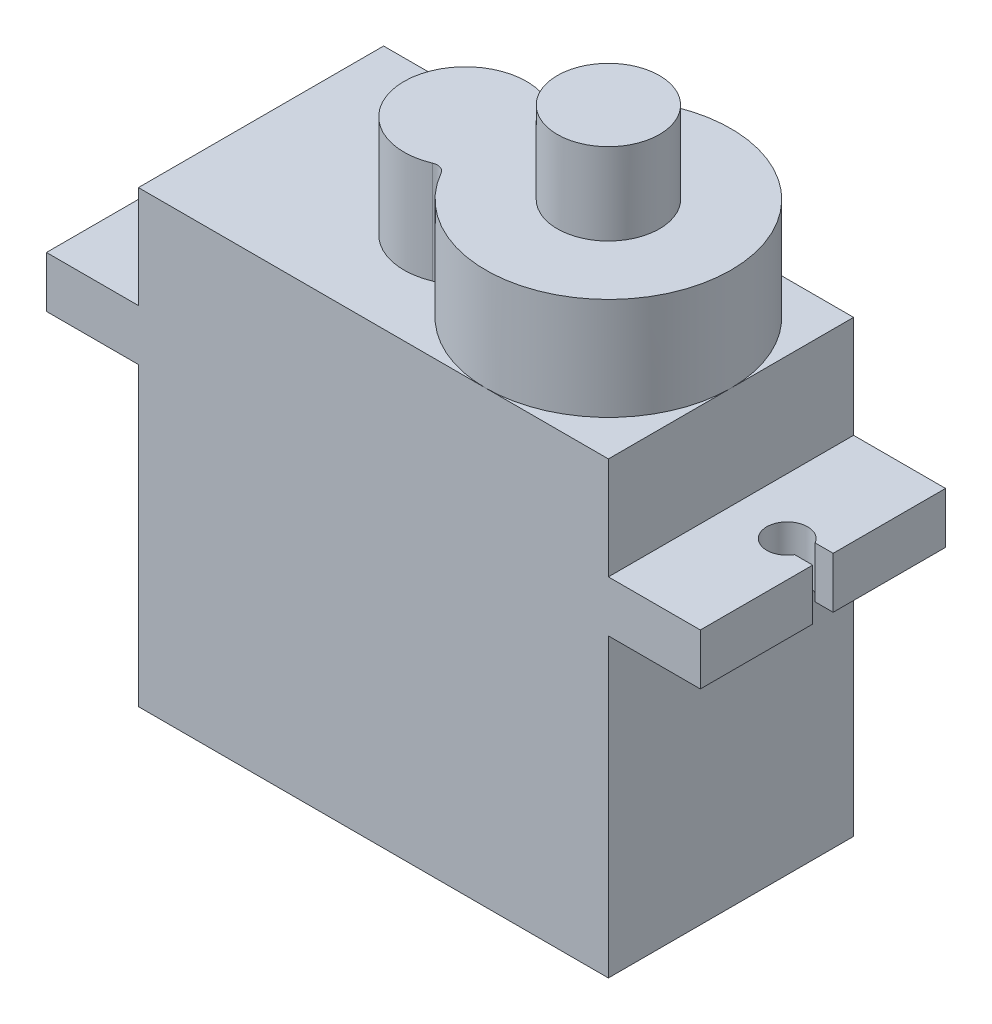
ISO-10303-21;
HEADER;
FILE_DESCRIPTION(('STEP AP214'),'2;1');
FILE_NAME('part.step','',(''),(''),'','','');
FILE_SCHEMA(('AUTOMOTIVE_DESIGN { 1 0 10303 214 1 1 1 1 }'));
ENDSEC;
DATA;
#1=APPLICATION_CONTEXT('core data for automotive mechanical design processes');
#2=APPLICATION_PROTOCOL_DEFINITION('international standard','automotive_design',2000,#1);
#3=PRODUCT_CONTEXT('',#1,'mechanical');
#4=PRODUCT('Part','Part','',(#3));
#5=PRODUCT_RELATED_PRODUCT_CATEGORY('part','',(#4));
#6=PRODUCT_DEFINITION_FORMATION('','',#4);
#7=PRODUCT_DEFINITION_CONTEXT('part definition',#1,'design');
#8=PRODUCT_DEFINITION('design','',#6,#7);
#9=PRODUCT_DEFINITION_SHAPE('','',#8);
#10=(LENGTH_UNIT() NAMED_UNIT(*) SI_UNIT(.MILLI.,.METRE.));
#11=(NAMED_UNIT(*) PLANE_ANGLE_UNIT() SI_UNIT($,.RADIAN.));
#12=(NAMED_UNIT(*) SI_UNIT($,.STERADIAN.) SOLID_ANGLE_UNIT());
#13=UNCERTAINTY_MEASURE_WITH_UNIT(LENGTH_MEASURE(1.E-05),#10,'distance_accuracy_value','');
#14=(GEOMETRIC_REPRESENTATION_CONTEXT(3) GLOBAL_UNCERTAINTY_ASSIGNED_CONTEXT((#13)) GLOBAL_UNIT_ASSIGNED_CONTEXT((#10,
#11,#12)) REPRESENTATION_CONTEXT('',''));
#15=CARTESIAN_POINT('',(0.,0.,0.));
#16=DIRECTION('',(0.,0.,1.));
#17=DIRECTION('',(1.,0.,0.));
#18=AXIS2_PLACEMENT_3D('',#15,#16,#17);
#19=CARTESIAN_POINT('',(0.,22.,0.));
#20=DIRECTION('',(0.,-1.,0.));
#21=DIRECTION('',(0.,0.,-1.));
#22=AXIS2_PLACEMENT_3D('',#19,#20,#21);
#23=PLANE('',#22);
#24=CARTESIAN_POINT('',(-0.142857142857141,22.,3.22616851161035));
#25=DIRECTION('',(0.,-1.,0.));
#26=DIRECTION('',(0.,0.,-1.));
#27=AXIS2_PLACEMENT_3D('',#24,#25,#26);
#28=CIRCLE('',#27,0.5);
#29=CARTESIAN_POINT('',(-0.33673469387755,22.,2.76528729566601));
#30=VERTEX_POINT('',#29);
#31=CARTESIAN_POINT('',(0.291208791208792,22.,2.97800170302494));
#32=VERTEX_POINT('',#31);
#33=EDGE_CURVE('E51',#30,#32,#28,.T.);
#34=ORIENTED_EDGE('',*,*,#33,.F.);
#35=CARTESIAN_POINT('',(-1.5,22.,0.));
#36=DIRECTION('',(0.,1.,0.));
#37=DIRECTION('',(0.,0.,1.));
#38=AXIS2_PLACEMENT_3D('',#35,#36,#37);
#39=CIRCLE('',#38,3.);
#40=CARTESIAN_POINT('',(-0.336734693877549,22.,-2.76528729566601));
#41=VERTEX_POINT('',#40);
#42=EDGE_CURVE('E55',#41,#30,#39,.T.);
#43=ORIENTED_EDGE('',*,*,#42,.F.);
#44=CARTESIAN_POINT('',(-0.142857142857141,22.,-3.22616851161035));
#45=DIRECTION('',(0.,-1.,0.));
#46=DIRECTION('',(0.,0.,1.));
#47=AXIS2_PLACEMENT_3D('',#44,#45,#46);
#48=CIRCLE('',#47,0.5);
#49=CARTESIAN_POINT('',(0.291208791208794,22.,-2.97800170302494));
#50=VERTEX_POINT('',#49);
#51=EDGE_CURVE('E385',#50,#41,#48,.T.);
#52=ORIENTED_EDGE('',*,*,#51,.F.);
#53=CARTESIAN_POINT('',(5.5,22.,0.));
#54=DIRECTION('',(0.,1.,0.));
#55=DIRECTION('',(0.,0.,1.));
#56=AXIS2_PLACEMENT_3D('',#53,#54,#55);
#57=CIRCLE('',#56,6.);
#58=CARTESIAN_POINT('',(5.5,22.,-6.));
#59=VERTEX_POINT('',#58);
#60=EDGE_CURVE('E376',#59,#50,#57,.T.);
#61=ORIENTED_EDGE('',*,*,#60,.F.);
#62=DIRECTION('',(-1.,0.,0.));
#63=VECTOR('',#62,1.);
#64=CARTESIAN_POINT('',(-11.5,22.,-6.));
#65=LINE('',#64,#63);
#66=CARTESIAN_POINT('',(-11.5,22.,-6.));
#67=VERTEX_POINT('',#66);
#68=EDGE_CURVE('E329',#59,#67,#65,.T.);
#69=ORIENTED_EDGE('',*,*,#68,.T.);
#70=DIRECTION('',(0.,0.,1.));
#71=VECTOR('',#70,1.);
#72=CARTESIAN_POINT('',(-11.5,22.,6.));
#73=LINE('',#72,#71);
#74=CARTESIAN_POINT('',(-11.5,22.,6.));
#75=VERTEX_POINT('',#74);
#76=EDGE_CURVE('E334',#67,#75,#73,.T.);
#77=ORIENTED_EDGE('',*,*,#76,.T.);
#78=DIRECTION('',(1.,0.,0.));
#79=VECTOR('',#78,1.);
#80=CARTESIAN_POINT('',(-11.5,22.,6.));
#81=LINE('',#80,#79);
#82=CARTESIAN_POINT('',(5.5,22.,6.));
#83=VERTEX_POINT('',#82);
#84=EDGE_CURVE('E337',#75,#83,#81,.T.);
#85=ORIENTED_EDGE('',*,*,#84,.T.);
#86=EDGE_CURVE('E381',#32,#83,#57,.T.);
#87=ORIENTED_EDGE('',*,*,#86,.F.);
#88=EDGE_LOOP('',(#34,#43,#52,#61,#69,#77,#85,#87));
#89=FACE_BOUND('',#88,.T.);
#90=ADVANCED_FACE('F36',(#89),#23,.F.);
#91=CARTESIAN_POINT('',(11.5,22.,0.));
#92=VERTEX_POINT('',#91);
#93=EDGE_CURVE('E44',#83,#92,#57,.T.);
#94=ORIENTED_EDGE('',*,*,#93,.F.);
#95=CARTESIAN_POINT('',(11.5,22.,6.));
#96=VERTEX_POINT('',#95);
#97=EDGE_CURVE('E336',#83,#96,#81,.T.);
#98=ORIENTED_EDGE('',*,*,#97,.T.);
#99=DIRECTION('',(0.,0.,-1.));
#100=VECTOR('',#99,1.);
#101=CARTESIAN_POINT('',(11.5,22.,6.));
#102=LINE('',#101,#100);
#103=EDGE_CURVE('E326',#96,#92,#102,.T.);
#104=ORIENTED_EDGE('',*,*,#103,.T.);
#105=EDGE_LOOP('',(#94,#98,#104));
#106=FACE_BOUND('',#105,.T.);
#107=ADVANCED_FACE('F390',(#106),#23,.F.);
#108=CARTESIAN_POINT('',(0.,14.5,0.));
#109=DIRECTION('',(0.,-1.,0.));
#110=DIRECTION('',(0.,0.,-1.));
#111=AXIS2_PLACEMENT_3D('',#108,#109,#110);
#112=PLANE('',#111);
#113=CARTESIAN_POINT('',(14.25,14.5,0.));
#114=DIRECTION('',(0.,-1.,0.));
#115=DIRECTION('',(0.,0.,-1.));
#116=AXIS2_PLACEMENT_3D('',#113,#114,#115);
#117=CIRCLE('',#116,1.);
#118=CARTESIAN_POINT('',(15.1160254037844,14.5,-0.5));
#119=VERTEX_POINT('',#118);
#120=CARTESIAN_POINT('',(15.1160254037844,14.5,0.499999999999999));
#121=VERTEX_POINT('',#120);
#122=EDGE_CURVE('E251',#119,#121,#117,.F.);
#123=ORIENTED_EDGE('',*,*,#122,.T.);
#124=DIRECTION('',(1.,0.,0.));
#125=VECTOR('',#124,1.);
#126=CARTESIAN_POINT('',(0.,14.5,0.49999999999998));
#127=LINE('',#126,#125);
#128=CARTESIAN_POINT('',(16.,14.5,0.5));
#129=VERTEX_POINT('',#128);
#130=EDGE_CURVE('E248',#121,#129,#127,.T.);
#131=ORIENTED_EDGE('',*,*,#130,.T.);
#132=DIRECTION('',(0.,0.,-1.));
#133=VECTOR('',#132,1.);
#134=CARTESIAN_POINT('',(16.,14.5,6.));
#135=LINE('',#134,#133);
#136=CARTESIAN_POINT('',(16.,14.5,6.));
#137=VERTEX_POINT('',#136);
#138=EDGE_CURVE('E272',#137,#129,#135,.T.);
#139=ORIENTED_EDGE('',*,*,#138,.F.);
#140=DIRECTION('',(1.,0.,0.));
#141=VECTOR('',#140,1.);
#142=CARTESIAN_POINT('',(-16.,14.5,6.));
#143=LINE('',#142,#141);
#144=CARTESIAN_POINT('',(11.5,14.5,6.));
#145=VERTEX_POINT('',#144);
#146=EDGE_CURVE('E284',#145,#137,#143,.T.);
#147=ORIENTED_EDGE('',*,*,#146,.F.);
#148=DIRECTION('',(0.,0.,1.));
#149=VECTOR('',#148,1.);
#150=CARTESIAN_POINT('',(11.5,14.5,6.));
#151=LINE('',#150,#149);
#152=CARTESIAN_POINT('',(11.5,14.5,-6.));
#153=VERTEX_POINT('',#152);
#154=EDGE_CURVE('E323',#153,#145,#151,.T.);
#155=ORIENTED_EDGE('',*,*,#154,.F.);
#156=DIRECTION('',(-1.,0.,0.));
#157=VECTOR('',#156,1.);
#158=CARTESIAN_POINT('',(-16.,14.5,-6.));
#159=LINE('',#158,#157);
#160=CARTESIAN_POINT('',(16.,14.5,-6.));
#161=VERTEX_POINT('',#160);
#162=EDGE_CURVE('E277',#161,#153,#159,.T.);
#163=ORIENTED_EDGE('',*,*,#162,.F.);
#164=CARTESIAN_POINT('',(16.,14.5,-0.5));
#165=VERTEX_POINT('',#164);
#166=EDGE_CURVE('E276',#165,#161,#135,.T.);
#167=ORIENTED_EDGE('',*,*,#166,.F.);
#168=DIRECTION('',(-1.,0.,0.));
#169=VECTOR('',#168,1.);
#170=CARTESIAN_POINT('',(0.,14.5,-0.5));
#171=LINE('',#170,#169);
#172=EDGE_CURVE('E244',#165,#119,#171,.T.);
#173=ORIENTED_EDGE('',*,*,#172,.T.);
#174=EDGE_LOOP('',(#123,#131,#139,#147,#155,#163,#167,#173));
#175=FACE_BOUND('',#174,.T.);
#176=ADVANCED_FACE('F442',(#175),#112,.T.);
#177=CARTESIAN_POINT('',(0.,17.,0.));
#178=DIRECTION('',(0.,-1.,0.));
#179=DIRECTION('',(0.,0.,-1.));
#180=AXIS2_PLACEMENT_3D('',#177,#178,#179);
#181=PLANE('',#180);
#182=DIRECTION('',(-1.,0.,0.));
#183=VECTOR('',#182,1.);
#184=CARTESIAN_POINT('',(16.,17.,0.5));
#185=LINE('',#184,#183);
#186=CARTESIAN_POINT('',(16.,17.,0.5));
#187=VERTEX_POINT('',#186);
#188=CARTESIAN_POINT('',(15.1160254037844,17.,0.499999999999999));
#189=VERTEX_POINT('',#188);
#190=EDGE_CURVE('E238',#187,#189,#185,.T.);
#191=ORIENTED_EDGE('',*,*,#190,.T.);
#192=CARTESIAN_POINT('',(14.25,17.,0.));
#193=DIRECTION('',(0.,-1.,0.));
#194=DIRECTION('',(0.,0.,1.));
#195=AXIS2_PLACEMENT_3D('',#192,#193,#194);
#196=CIRCLE('',#195,1.);
#197=CARTESIAN_POINT('',(15.1160254037844,17.,-0.5));
#198=VERTEX_POINT('',#197);
#199=EDGE_CURVE('E230',#189,#198,#196,.T.);
#200=ORIENTED_EDGE('',*,*,#199,.T.);
#201=DIRECTION('',(1.,0.,0.));
#202=VECTOR('',#201,1.);
#203=CARTESIAN_POINT('',(16.,17.,-0.5));
#204=LINE('',#203,#202);
#205=CARTESIAN_POINT('',(16.,17.,-0.5));
#206=VERTEX_POINT('',#205);
#207=EDGE_CURVE('E227',#198,#206,#204,.T.);
#208=ORIENTED_EDGE('',*,*,#207,.T.);
#209=DIRECTION('',(0.,0.,-1.));
#210=VECTOR('',#209,1.);
#211=CARTESIAN_POINT('',(16.,17.,6.));
#212=LINE('',#211,#210);
#213=CARTESIAN_POINT('',(16.,17.,-6.));
#214=VERTEX_POINT('',#213);
#215=EDGE_CURVE('E266',#206,#214,#212,.T.);
#216=ORIENTED_EDGE('',*,*,#215,.T.);
#217=DIRECTION('',(-1.,0.,0.));
#218=VECTOR('',#217,1.);
#219=CARTESIAN_POINT('',(-16.,17.,-6.));
#220=LINE('',#219,#218);
#221=CARTESIAN_POINT('',(11.5,17.,-6.));
#222=VERTEX_POINT('',#221);
#223=EDGE_CURVE('E293',#214,#222,#220,.T.);
#224=ORIENTED_EDGE('',*,*,#223,.T.);
#225=DIRECTION('',(0.,0.,1.));
#226=VECTOR('',#225,1.);
#227=CARTESIAN_POINT('',(11.5,17.,6.));
#228=LINE('',#227,#226);
#229=CARTESIAN_POINT('',(11.5,17.,6.));
#230=VERTEX_POINT('',#229);
#231=EDGE_CURVE('E318',#222,#230,#228,.T.);
#232=ORIENTED_EDGE('',*,*,#231,.T.);
#233=DIRECTION('',(1.,0.,0.));
#234=VECTOR('',#233,1.);
#235=CARTESIAN_POINT('',(-16.,17.,6.));
#236=LINE('',#235,#234);
#237=CARTESIAN_POINT('',(16.,17.,6.));
#238=VERTEX_POINT('',#237);
#239=EDGE_CURVE('E300',#230,#238,#236,.T.);
#240=ORIENTED_EDGE('',*,*,#239,.T.);
#241=EDGE_CURVE('E289',#238,#187,#212,.T.);
#242=ORIENTED_EDGE('',*,*,#241,.T.);
#243=EDGE_LOOP('',(#191,#200,#208,#216,#224,#232,#240,#242));
#244=FACE_BOUND('',#243,.T.);
#245=ADVANCED_FACE('F446',(#244),#181,.F.);
#246=CARTESIAN_POINT('',(16.,14.5,6.));
#247=DIRECTION('',(1.,0.,0.));
#248=DIRECTION('',(0.,0.,-1.));
#249=AXIS2_PLACEMENT_3D('',#246,#247,#248);
#250=PLANE('',#249);
#251=ORIENTED_EDGE('',*,*,#138,.T.);
#252=DIRECTION('',(0.,1.,0.));
#253=VECTOR('',#252,1.);
#254=CARTESIAN_POINT('',(16.,14.5,0.5));
#255=LINE('',#254,#253);
#256=EDGE_CURVE('E374',#129,#187,#255,.T.);
#257=ORIENTED_EDGE('',*,*,#256,.T.);
#258=ORIENTED_EDGE('',*,*,#241,.F.);
#259=DIRECTION('',(0.,1.,0.));
#260=VECTOR('',#259,1.);
#261=CARTESIAN_POINT('',(16.,14.5,6.));
#262=LINE('',#261,#260);
#263=EDGE_CURVE('E304',#137,#238,#262,.T.);
#264=ORIENTED_EDGE('',*,*,#263,.F.);
#265=EDGE_LOOP('',(#251,#257,#258,#264));
#266=FACE_BOUND('',#265,.T.);
#267=ADVANCED_FACE('F444',(#266),#250,.T.);
#268=ORIENTED_EDGE('',*,*,#215,.F.);
#269=DIRECTION('',(0.,-1.,0.));
#270=VECTOR('',#269,1.);
#271=CARTESIAN_POINT('',(16.,14.5,-0.5));
#272=LINE('',#271,#270);
#273=EDGE_CURVE('E372',#206,#165,#272,.T.);
#274=ORIENTED_EDGE('',*,*,#273,.T.);
#275=ORIENTED_EDGE('',*,*,#166,.T.);
#276=DIRECTION('',(0.,1.,0.));
#277=VECTOR('',#276,1.);
#278=CARTESIAN_POINT('',(16.,14.5,-6.));
#279=LINE('',#278,#277);
#280=EDGE_CURVE('E288',#161,#214,#279,.T.);
#281=ORIENTED_EDGE('',*,*,#280,.T.);
#282=EDGE_LOOP('',(#268,#274,#275,#281));
#283=FACE_BOUND('',#282,.T.);
#284=ADVANCED_FACE('F491',(#283),#250,.T.);
#285=CARTESIAN_POINT('',(-16.,14.5,6.));
#286=DIRECTION('',(-1.,0.,0.));
#287=DIRECTION('',(0.,0.,1.));
#288=AXIS2_PLACEMENT_3D('',#285,#286,#287);
#289=PLANE('',#288);
#290=DIRECTION('',(0.,1.,0.));
#291=VECTOR('',#290,1.);
#292=CARTESIAN_POINT('',(-16.,0.,-0.5));
#293=LINE('',#292,#291);
#294=CARTESIAN_POINT('',(-16.,14.5,-0.5));
#295=VERTEX_POINT('',#294);
#296=CARTESIAN_POINT('',(-16.,17.,-0.5));
#297=VERTEX_POINT('',#296);
#298=EDGE_CURVE('E263',#295,#297,#293,.T.);
#299=ORIENTED_EDGE('',*,*,#298,.T.);
#300=DIRECTION('',(0.,0.,1.));
#301=VECTOR('',#300,1.);
#302=CARTESIAN_POINT('',(-16.,17.,6.));
#303=LINE('',#302,#301);
#304=CARTESIAN_POINT('',(-16.,17.,-6.));
#305=VERTEX_POINT('',#304);
#306=EDGE_CURVE('E297',#305,#297,#303,.T.);
#307=ORIENTED_EDGE('',*,*,#306,.F.);
#308=DIRECTION('',(0.,1.,0.));
#309=VECTOR('',#308,1.);
#310=CARTESIAN_POINT('',(-16.,14.5,-6.));
#311=LINE('',#310,#309);
#312=CARTESIAN_POINT('',(-16.,14.5,-6.));
#313=VERTEX_POINT('',#312);
#314=EDGE_CURVE('E311',#313,#305,#311,.T.);
#315=ORIENTED_EDGE('',*,*,#314,.F.);
#316=DIRECTION('',(0.,0.,1.));
#317=VECTOR('',#316,1.);
#318=CARTESIAN_POINT('',(-16.,14.5,6.));
#319=LINE('',#318,#317);
#320=EDGE_CURVE('E281',#313,#295,#319,.T.);
#321=ORIENTED_EDGE('',*,*,#320,.T.);
#322=EDGE_LOOP('',(#299,#307,#315,#321));
#323=FACE_BOUND('',#322,.T.);
#324=ADVANCED_FACE('F489',(#323),#289,.T.);
#325=CARTESIAN_POINT('',(11.5,22.,6.));
#326=DIRECTION('',(-1.,0.,0.));
#327=DIRECTION('',(0.,0.,1.));
#328=AXIS2_PLACEMENT_3D('',#325,#326,#327);
#329=PLANE('',#328);
#330=ORIENTED_EDGE('',*,*,#231,.F.);
#331=DIRECTION('',(0.,-1.,0.));
#332=VECTOR('',#331,1.);
#333=CARTESIAN_POINT('',(11.5,22.,-6.));
#334=LINE('',#333,#332);
#335=CARTESIAN_POINT('',(11.5,22.,-6.));
#336=VERTEX_POINT('',#335);
#337=EDGE_CURVE('E362',#336,#222,#334,.T.);
#338=ORIENTED_EDGE('',*,*,#337,.F.);
#339=EDGE_CURVE('E330',#92,#336,#102,.T.);
#340=ORIENTED_EDGE('',*,*,#339,.F.);
#341=ORIENTED_EDGE('',*,*,#103,.F.);
#342=DIRECTION('',(0.,-1.,0.));
#343=VECTOR('',#342,1.);
#344=CARTESIAN_POINT('',(11.5,22.,6.));
#345=LINE('',#344,#343);
#346=EDGE_CURVE('E352',#96,#230,#345,.T.);
#347=ORIENTED_EDGE('',*,*,#346,.T.);
#348=EDGE_LOOP('',(#330,#338,#340,#341,#347));
#349=FACE_BOUND('',#348,.T.);
#350=ADVANCED_FACE('F450',(#349),#329,.F.);
#351=CARTESIAN_POINT('',(-11.5,22.,6.));
#352=DIRECTION('',(1.,0.,0.));
#353=DIRECTION('',(0.,0.,-1.));
#354=AXIS2_PLACEMENT_3D('',#351,#352,#353);
#355=PLANE('',#354);
#356=DIRECTION('',(0.,0.,-1.));
#357=VECTOR('',#356,1.);
#358=CARTESIAN_POINT('',(-11.5,17.,6.));
#359=LINE('',#358,#357);
#360=CARTESIAN_POINT('',(-11.5,17.,6.));
#361=VERTEX_POINT('',#360);
#362=CARTESIAN_POINT('',(-11.5,17.,-6.));
#363=VERTEX_POINT('',#362);
#364=EDGE_CURVE('E307',#361,#363,#359,.T.);
#365=ORIENTED_EDGE('',*,*,#364,.F.);
#366=DIRECTION('',(0.,-1.,0.));
#367=VECTOR('',#366,1.);
#368=CARTESIAN_POINT('',(-11.5,22.,6.));
#369=LINE('',#368,#367);
#370=EDGE_CURVE('E355',#75,#361,#369,.T.);
#371=ORIENTED_EDGE('',*,*,#370,.F.);
#372=ORIENTED_EDGE('',*,*,#76,.F.);
#373=DIRECTION('',(0.,-1.,0.));
#374=VECTOR('',#373,1.);
#375=CARTESIAN_POINT('',(-11.5,22.,-6.));
#376=LINE('',#375,#374);
#377=EDGE_CURVE('E359',#67,#363,#376,.T.);
#378=ORIENTED_EDGE('',*,*,#377,.T.);
#379=EDGE_LOOP('',(#365,#371,#372,#378));
#380=FACE_BOUND('',#379,.T.);
#381=ADVANCED_FACE('F403',(#380),#355,.F.);
#382=CARTESIAN_POINT('',(11.5,0.,-6.));
#383=VERTEX_POINT('',#382);
#384=EDGE_CURVE('E361',#153,#383,#334,.T.);
#385=ORIENTED_EDGE('',*,*,#384,.F.);
#386=ORIENTED_EDGE('',*,*,#154,.T.);
#387=CARTESIAN_POINT('',(11.5,0.,6.));
#388=VERTEX_POINT('',#387);
#389=EDGE_CURVE('E340',#145,#388,#345,.T.);
#390=ORIENTED_EDGE('',*,*,#389,.T.);
#391=DIRECTION('',(0.,0.,-1.));
#392=VECTOR('',#391,1.);
#393=CARTESIAN_POINT('',(11.5,0.,6.));
#394=LINE('',#393,#392);
#395=EDGE_CURVE('E325',#388,#383,#394,.T.);
#396=ORIENTED_EDGE('',*,*,#395,.T.);
#397=EDGE_LOOP('',(#385,#386,#390,#396));
#398=FACE_BOUND('',#397,.T.);
#399=ADVANCED_FACE('F38',(#398),#329,.F.);
#400=CARTESIAN_POINT('',(-11.5,22.,-6.));
#401=DIRECTION('',(0.,0.,1.));
#402=DIRECTION('',(1.,0.,0.));
#403=AXIS2_PLACEMENT_3D('',#400,#401,#402);
#404=PLANE('',#403);
#405=CARTESIAN_POINT('',(-11.5,14.5,-6.));
#406=VERTEX_POINT('',#405);
#407=CARTESIAN_POINT('',(-11.5,0.,-6.));
#408=VERTEX_POINT('',#407);
#409=EDGE_CURVE('E358',#406,#408,#376,.T.);
#410=ORIENTED_EDGE('',*,*,#409,.F.);
#411=EDGE_CURVE('E275',#406,#313,#159,.T.);
#412=ORIENTED_EDGE('',*,*,#411,.T.);
#413=ORIENTED_EDGE('',*,*,#314,.T.);
#414=EDGE_CURVE('E292',#363,#305,#220,.T.);
#415=ORIENTED_EDGE('',*,*,#414,.F.);
#416=ORIENTED_EDGE('',*,*,#377,.F.);
#417=ORIENTED_EDGE('',*,*,#68,.F.);
#418=EDGE_CURVE('E331',#336,#59,#65,.T.);
#419=ORIENTED_EDGE('',*,*,#418,.F.);
#420=ORIENTED_EDGE('',*,*,#337,.T.);
#421=ORIENTED_EDGE('',*,*,#223,.F.);
#422=ORIENTED_EDGE('',*,*,#280,.F.);
#423=ORIENTED_EDGE('',*,*,#162,.T.);
#424=ORIENTED_EDGE('',*,*,#384,.T.);
#425=DIRECTION('',(-1.,0.,0.));
#426=VECTOR('',#425,1.);
#427=CARTESIAN_POINT('',(-11.5,0.,-6.));
#428=LINE('',#427,#426);
#429=EDGE_CURVE('E343',#383,#408,#428,.T.);
#430=ORIENTED_EDGE('',*,*,#429,.T.);
#431=EDGE_LOOP('',(#410,#412,#413,#415,#416,#417,#419,#420,#421,#422,#423,#424,#430));
#432=FACE_BOUND('',#431,.T.);
#433=ADVANCED_FACE('F428',(#432),#404,.F.);
#434=CARTESIAN_POINT('',(-11.5,14.5,6.));
#435=VERTEX_POINT('',#434);
#436=CARTESIAN_POINT('',(-11.5,0.,6.));
#437=VERTEX_POINT('',#436);
#438=EDGE_CURVE('E354',#435,#437,#369,.T.);
#439=ORIENTED_EDGE('',*,*,#438,.F.);
#440=DIRECTION('',(0.,0.,-1.));
#441=VECTOR('',#440,1.);
#442=CARTESIAN_POINT('',(-11.5,14.5,6.));
#443=LINE('',#442,#441);
#444=EDGE_CURVE('E321',#435,#406,#443,.T.);
#445=ORIENTED_EDGE('',*,*,#444,.T.);
#446=ORIENTED_EDGE('',*,*,#409,.T.);
#447=DIRECTION('',(0.,0.,1.));
#448=VECTOR('',#447,1.);
#449=CARTESIAN_POINT('',(-11.5,0.,6.));
#450=LINE('',#449,#448);
#451=EDGE_CURVE('E346',#408,#437,#450,.T.);
#452=ORIENTED_EDGE('',*,*,#451,.T.);
#453=EDGE_LOOP('',(#439,#445,#446,#452));
#454=FACE_BOUND('',#453,.T.);
#455=ADVANCED_FACE('F426',(#454),#355,.F.);
#456=CARTESIAN_POINT('',(-11.5,22.,6.));
#457=DIRECTION('',(0.,0.,-1.));
#458=DIRECTION('',(-1.,0.,0.));
#459=AXIS2_PLACEMENT_3D('',#456,#457,#458);
#460=PLANE('',#459);
#461=ORIENTED_EDGE('',*,*,#389,.F.);
#462=ORIENTED_EDGE('',*,*,#146,.T.);
#463=ORIENTED_EDGE('',*,*,#263,.T.);
#464=ORIENTED_EDGE('',*,*,#239,.F.);
#465=ORIENTED_EDGE('',*,*,#346,.F.);
#466=ORIENTED_EDGE('',*,*,#97,.F.);
#467=ORIENTED_EDGE('',*,*,#84,.F.);
#468=ORIENTED_EDGE('',*,*,#370,.T.);
#469=CARTESIAN_POINT('',(-16.,17.,6.));
#470=VERTEX_POINT('',#469);
#471=EDGE_CURVE('E301',#470,#361,#236,.T.);
#472=ORIENTED_EDGE('',*,*,#471,.F.);
#473=DIRECTION('',(0.,1.,0.));
#474=VECTOR('',#473,1.);
#475=CARTESIAN_POINT('',(-16.,14.5,6.));
#476=LINE('',#475,#474);
#477=CARTESIAN_POINT('',(-16.,14.5,6.));
#478=VERTEX_POINT('',#477);
#479=EDGE_CURVE('E308',#478,#470,#476,.T.);
#480=ORIENTED_EDGE('',*,*,#479,.F.);
#481=EDGE_CURVE('E285',#478,#435,#143,.T.);
#482=ORIENTED_EDGE('',*,*,#481,.T.);
#483=ORIENTED_EDGE('',*,*,#438,.T.);
#484=DIRECTION('',(1.,0.,0.));
#485=VECTOR('',#484,1.);
#486=CARTESIAN_POINT('',(-11.5,0.,6.));
#487=LINE('',#486,#485);
#488=EDGE_CURVE('E349',#437,#388,#487,.T.);
#489=ORIENTED_EDGE('',*,*,#488,.T.);
#490=EDGE_LOOP('',(#461,#462,#463,#464,#465,#466,#467,#468,#472,#480,#482,#483,#489));
#491=FACE_BOUND('',#490,.T.);
#492=ADVANCED_FACE('F396',(#491),#460,.F.);
#493=EDGE_CURVE('E379',#92,#59,#57,.T.);
#494=ORIENTED_EDGE('',*,*,#493,.F.);
#495=ORIENTED_EDGE('',*,*,#339,.T.);
#496=ORIENTED_EDGE('',*,*,#418,.T.);
#497=EDGE_LOOP('',(#494,#495,#496));
#498=FACE_BOUND('',#497,.T.);
#499=ADVANCED_FACE('F455',(#498),#23,.F.);
#500=CARTESIAN_POINT('',(0.,0.,0.));
#501=DIRECTION('',(0.,-1.,0.));
#502=DIRECTION('',(0.,0.,-1.));
#503=AXIS2_PLACEMENT_3D('',#500,#501,#502);
#504=PLANE('',#503);
#505=ORIENTED_EDGE('',*,*,#395,.F.);
#506=ORIENTED_EDGE('',*,*,#488,.F.);
#507=ORIENTED_EDGE('',*,*,#451,.F.);
#508=ORIENTED_EDGE('',*,*,#429,.F.);
#509=EDGE_LOOP('',(#505,#506,#507,#508));
#510=FACE_BOUND('',#509,.T.);
#511=ADVANCED_FACE('F435',(#510),#504,.T.);
#512=DIRECTION('',(0.,1.,0.));
#513=VECTOR('',#512,1.);
#514=CARTESIAN_POINT('',(-16.,0.,0.5));
#515=LINE('',#514,#513);
#516=CARTESIAN_POINT('',(-16.,14.5,0.5));
#517=VERTEX_POINT('',#516);
#518=CARTESIAN_POINT('',(-16.,17.,0.5));
#519=VERTEX_POINT('',#518);
#520=EDGE_CURVE('E262',#517,#519,#515,.T.);
#521=ORIENTED_EDGE('',*,*,#520,.F.);
#522=EDGE_CURVE('E280',#517,#478,#319,.T.);
#523=ORIENTED_EDGE('',*,*,#522,.T.);
#524=ORIENTED_EDGE('',*,*,#479,.T.);
#525=EDGE_CURVE('E296',#519,#470,#303,.T.);
#526=ORIENTED_EDGE('',*,*,#525,.F.);
#527=EDGE_LOOP('',(#521,#523,#524,#526));
#528=FACE_BOUND('',#527,.T.);
#529=ADVANCED_FACE('F414',(#528),#289,.T.);
#530=ORIENTED_EDGE('',*,*,#306,.T.);
#531=DIRECTION('',(-1.,0.,0.));
#532=VECTOR('',#531,1.);
#533=CARTESIAN_POINT('',(-16.,17.,-0.5));
#534=LINE('',#533,#532);
#535=CARTESIAN_POINT('',(-15.1160254037844,17.,-0.5));
#536=VERTEX_POINT('',#535);
#537=EDGE_CURVE('E260',#536,#297,#534,.T.);
#538=ORIENTED_EDGE('',*,*,#537,.F.);
#539=CARTESIAN_POINT('',(-14.25,17.,0.));
#540=DIRECTION('',(0.,1.,0.));
#541=DIRECTION('',(0.,0.,1.));
#542=AXIS2_PLACEMENT_3D('',#539,#540,#541);
#543=CIRCLE('',#542,1.);
#544=CARTESIAN_POINT('',(-15.1160254037844,17.,0.499999999999999));
#545=VERTEX_POINT('',#544);
#546=EDGE_CURVE('E257',#545,#536,#543,.T.);
#547=ORIENTED_EDGE('',*,*,#546,.F.);
#548=DIRECTION('',(1.,0.,0.));
#549=VECTOR('',#548,1.);
#550=CARTESIAN_POINT('',(-16.,17.,0.5));
#551=LINE('',#550,#549);
#552=EDGE_CURVE('E254',#519,#545,#551,.T.);
#553=ORIENTED_EDGE('',*,*,#552,.F.);
#554=ORIENTED_EDGE('',*,*,#525,.T.);
#555=ORIENTED_EDGE('',*,*,#471,.T.);
#556=ORIENTED_EDGE('',*,*,#364,.T.);
#557=ORIENTED_EDGE('',*,*,#414,.T.);
#558=EDGE_LOOP('',(#530,#538,#547,#553,#554,#555,#556,#557));
#559=FACE_BOUND('',#558,.T.);
#560=ADVANCED_FACE('F407',(#559),#181,.F.);
#561=DIRECTION('',(1.,0.,0.));
#562=VECTOR('',#561,1.);
#563=CARTESIAN_POINT('',(0.,14.5,-0.5));
#564=LINE('',#563,#562);
#565=CARTESIAN_POINT('',(-15.1160254037844,14.5,-0.5));
#566=VERTEX_POINT('',#565);
#567=EDGE_CURVE('E370',#295,#566,#564,.T.);
#568=ORIENTED_EDGE('',*,*,#567,.F.);
#569=ORIENTED_EDGE('',*,*,#320,.F.);
#570=ORIENTED_EDGE('',*,*,#411,.F.);
#571=ORIENTED_EDGE('',*,*,#444,.F.);
#572=ORIENTED_EDGE('',*,*,#481,.F.);
#573=ORIENTED_EDGE('',*,*,#522,.F.);
#574=DIRECTION('',(-1.,0.,0.));
#575=VECTOR('',#574,1.);
#576=CARTESIAN_POINT('',(0.,14.5,0.49999999999998));
#577=LINE('',#576,#575);
#578=CARTESIAN_POINT('',(-15.1160254037844,14.5,0.499999999999999));
#579=VERTEX_POINT('',#578);
#580=EDGE_CURVE('E365',#579,#517,#577,.T.);
#581=ORIENTED_EDGE('',*,*,#580,.F.);
#582=CARTESIAN_POINT('',(-14.25,14.5,0.));
#583=DIRECTION('',(0.,-1.,0.));
#584=DIRECTION('',(0.,0.,-1.));
#585=AXIS2_PLACEMENT_3D('',#582,#583,#584);
#586=CIRCLE('',#585,1.);
#587=EDGE_CURVE('E367',#566,#579,#586,.T.);
#588=ORIENTED_EDGE('',*,*,#587,.F.);
#589=EDGE_LOOP('',(#568,#569,#570,#571,#572,#573,#581,#588));
#590=FACE_BOUND('',#589,.T.);
#591=ADVANCED_FACE('F420',(#590),#112,.T.);
#592=CARTESIAN_POINT('',(-16.,0.,-0.5));
#593=DIRECTION('',(0.,0.,-1.));
#594=DIRECTION('',(-1.,0.,0.));
#595=AXIS2_PLACEMENT_3D('',#592,#593,#594);
#596=PLANE('',#595);
#597=ORIENTED_EDGE('',*,*,#567,.T.);
#598=DIRECTION('',(0.,1.,0.));
#599=VECTOR('',#598,1.);
#600=CARTESIAN_POINT('',(-15.1160254037844,0.,-0.5));
#601=LINE('',#600,#599);
#602=EDGE_CURVE('E267',#566,#536,#601,.T.);
#603=ORIENTED_EDGE('',*,*,#602,.T.);
#604=ORIENTED_EDGE('',*,*,#537,.T.);
#605=ORIENTED_EDGE('',*,*,#298,.F.);
#606=EDGE_LOOP('',(#597,#603,#604,#605));
#607=FACE_BOUND('',#606,.T.);
#608=ADVANCED_FACE('F477',(#607),#596,.F.);
#609=CARTESIAN_POINT('',(-14.25,0.,0.));
#610=DIRECTION('',(0.,1.,0.));
#611=DIRECTION('',(0.,0.,1.));
#612=AXIS2_PLACEMENT_3D('',#609,#610,#611);
#613=CYLINDRICAL_SURFACE('',#612,1.);
#614=ORIENTED_EDGE('',*,*,#587,.T.);
#615=DIRECTION('',(0.,1.,0.));
#616=VECTOR('',#615,1.);
#617=CARTESIAN_POINT('',(-15.1160254037844,0.,0.499999999999999));
#618=LINE('',#617,#616);
#619=EDGE_CURVE('E269',#579,#545,#618,.T.);
#620=ORIENTED_EDGE('',*,*,#619,.T.);
#621=ORIENTED_EDGE('',*,*,#546,.T.);
#622=ORIENTED_EDGE('',*,*,#602,.F.);
#623=EDGE_LOOP('',(#614,#620,#621,#622));
#624=FACE_BOUND('',#623,.T.);
#625=ADVANCED_FACE('F482',(#624),#613,.F.);
#626=CARTESIAN_POINT('',(-16.,0.,0.5));
#627=DIRECTION('',(0.,0.,1.));
#628=DIRECTION('',(1.,0.,0.));
#629=AXIS2_PLACEMENT_3D('',#626,#627,#628);
#630=PLANE('',#629);
#631=ORIENTED_EDGE('',*,*,#580,.T.);
#632=ORIENTED_EDGE('',*,*,#520,.T.);
#633=ORIENTED_EDGE('',*,*,#552,.T.);
#634=ORIENTED_EDGE('',*,*,#619,.F.);
#635=EDGE_LOOP('',(#631,#632,#633,#634));
#636=FACE_BOUND('',#635,.T.);
#637=ADVANCED_FACE('F513',(#636),#630,.F.);
#638=CARTESIAN_POINT('',(16.,0.,0.5));
#639=DIRECTION('',(0.,0.,-1.));
#640=DIRECTION('',(-1.,0.,0.));
#641=AXIS2_PLACEMENT_3D('',#638,#639,#640);
#642=PLANE('',#641);
#643=DIRECTION('',(0.,1.,0.));
#644=VECTOR('',#643,1.);
#645=CARTESIAN_POINT('',(15.1160254037844,0.,0.499999999999999));
#646=LINE('',#645,#644);
#647=EDGE_CURVE('E242',#121,#189,#646,.T.);
#648=ORIENTED_EDGE('',*,*,#647,.T.);
#649=ORIENTED_EDGE('',*,*,#190,.F.);
#650=ORIENTED_EDGE('',*,*,#256,.F.);
#651=ORIENTED_EDGE('',*,*,#130,.F.);
#652=EDGE_LOOP('',(#648,#649,#650,#651));
#653=FACE_BOUND('',#652,.T.);
#654=ADVANCED_FACE('F511',(#653),#642,.T.);
#655=CARTESIAN_POINT('',(14.25,0.,0.));
#656=DIRECTION('',(0.,1.,0.));
#657=DIRECTION('',(0.,0.,1.));
#658=AXIS2_PLACEMENT_3D('',#655,#656,#657);
#659=CYLINDRICAL_SURFACE('',#658,1.);
#660=DIRECTION('',(0.,1.,0.));
#661=VECTOR('',#660,1.);
#662=CARTESIAN_POINT('',(15.1160254037844,0.,-0.5));
#663=LINE('',#662,#661);
#664=EDGE_CURVE('E241',#119,#198,#663,.T.);
#665=ORIENTED_EDGE('',*,*,#664,.T.);
#666=ORIENTED_EDGE('',*,*,#199,.F.);
#667=ORIENTED_EDGE('',*,*,#647,.F.);
#668=ORIENTED_EDGE('',*,*,#122,.F.);
#669=EDGE_LOOP('',(#665,#666,#667,#668));
#670=FACE_BOUND('',#669,.T.);
#671=ADVANCED_FACE('F509',(#670),#659,.F.);
#672=CARTESIAN_POINT('',(16.,0.,-0.5));
#673=DIRECTION('',(0.,0.,1.));
#674=DIRECTION('',(1.,0.,0.));
#675=AXIS2_PLACEMENT_3D('',#672,#673,#674);
#676=PLANE('',#675);
#677=ORIENTED_EDGE('',*,*,#273,.F.);
#678=ORIENTED_EDGE('',*,*,#207,.F.);
#679=ORIENTED_EDGE('',*,*,#664,.F.);
#680=ORIENTED_EDGE('',*,*,#172,.F.);
#681=EDGE_LOOP('',(#677,#678,#679,#680));
#682=FACE_BOUND('',#681,.T.);
#683=ADVANCED_FACE('F506',(#682),#676,.T.);
#684=CARTESIAN_POINT('',(-0.142857142857141,27.,3.22616851161035));
#685=DIRECTION('',(0.,-1.,0.));
#686=DIRECTION('',(0.,0.,-1.));
#687=AXIS2_PLACEMENT_3D('',#684,#685,#686);
#688=CYLINDRICAL_SURFACE('',#687,0.5);
#689=ORIENTED_EDGE('',*,*,#33,.T.);
#690=DIRECTION('',(0.,-1.,0.));
#691=VECTOR('',#690,1.);
#692=CARTESIAN_POINT('',(0.291208791208792,27.,2.97800170302494));
#693=LINE('',#692,#691);
#694=CARTESIAN_POINT('',(0.291208791208792,27.,2.97800170302494));
#695=VERTEX_POINT('',#694);
#696=EDGE_CURVE('E209',#695,#32,#693,.T.);
#697=ORIENTED_EDGE('',*,*,#696,.F.);
#698=CARTESIAN_POINT('',(-0.142857142857141,27.,3.22616851161035));
#699=DIRECTION('',(0.,-1.,0.));
#700=DIRECTION('',(0.,0.,-1.));
#701=AXIS2_PLACEMENT_3D('',#698,#699,#700);
#702=CIRCLE('',#701,0.5);
#703=CARTESIAN_POINT('',(-0.33673469387755,27.,2.76528729566601));
#704=VERTEX_POINT('',#703);
#705=EDGE_CURVE('E216',#704,#695,#702,.T.);
#706=ORIENTED_EDGE('',*,*,#705,.F.);
#707=DIRECTION('',(0.,-1.,0.));
#708=VECTOR('',#707,1.);
#709=CARTESIAN_POINT('',(-0.33673469387755,27.,2.76528729566601));
#710=LINE('',#709,#708);
#711=EDGE_CURVE('E688',#704,#30,#710,.T.);
#712=ORIENTED_EDGE('',*,*,#711,.T.);
#713=EDGE_LOOP('',(#689,#697,#706,#712));
#714=FACE_BOUND('',#713,.T.);
#715=ADVANCED_FACE('F226',(#714),#688,.F.);
#716=CARTESIAN_POINT('',(5.5,27.,0.));
#717=DIRECTION('',(0.,-1.,0.));
#718=DIRECTION('',(0.,0.,-1.));
#719=AXIS2_PLACEMENT_3D('',#716,#717,#718);
#720=CYLINDRICAL_SURFACE('',#719,6.);
#721=ORIENTED_EDGE('',*,*,#86,.T.);
#722=ORIENTED_EDGE('',*,*,#93,.T.);
#723=ORIENTED_EDGE('',*,*,#493,.T.);
#724=ORIENTED_EDGE('',*,*,#60,.T.);
#725=DIRECTION('',(0.,-1.,0.));
#726=VECTOR('',#725,1.);
#727=CARTESIAN_POINT('',(0.291208791208794,27.,-2.97800170302494));
#728=LINE('',#727,#726);
#729=CARTESIAN_POINT('',(0.291208791208794,27.,-2.97800170302494));
#730=VERTEX_POINT('',#729);
#731=EDGE_CURVE('E212',#730,#50,#728,.T.);
#732=ORIENTED_EDGE('',*,*,#731,.F.);
#733=CARTESIAN_POINT('',(5.5,27.,0.));
#734=DIRECTION('',(0.,1.,0.));
#735=DIRECTION('',(0.,0.,1.));
#736=AXIS2_PLACEMENT_3D('',#733,#734,#735);
#737=CIRCLE('',#736,6.);
#738=EDGE_CURVE('E204',#695,#730,#737,.T.);
#739=ORIENTED_EDGE('',*,*,#738,.F.);
#740=ORIENTED_EDGE('',*,*,#696,.T.);
#741=EDGE_LOOP('',(#721,#722,#723,#724,#732,#739,#740));
#742=FACE_BOUND('',#741,.T.);
#743=ADVANCED_FACE('F207',(#742),#720,.T.);
#744=CARTESIAN_POINT('',(-0.142857142857141,27.,-3.22616851161035));
#745=DIRECTION('',(0.,-1.,0.));
#746=DIRECTION('',(0.,0.,-1.));
#747=AXIS2_PLACEMENT_3D('',#744,#745,#746);
#748=CYLINDRICAL_SURFACE('',#747,0.5);
#749=ORIENTED_EDGE('',*,*,#51,.T.);
#750=DIRECTION('',(0.,-1.,0.));
#751=VECTOR('',#750,1.);
#752=CARTESIAN_POINT('',(-0.336734693877549,27.,-2.76528729566601));
#753=LINE('',#752,#751);
#754=CARTESIAN_POINT('',(-0.336734693877549,27.,-2.76528729566601));
#755=VERTEX_POINT('',#754);
#756=EDGE_CURVE('E232',#755,#41,#753,.T.);
#757=ORIENTED_EDGE('',*,*,#756,.F.);
#758=CARTESIAN_POINT('',(-0.142857142857141,27.,-3.22616851161035));
#759=DIRECTION('',(0.,-1.,0.));
#760=DIRECTION('',(0.,0.,1.));
#761=AXIS2_PLACEMENT_3D('',#758,#759,#760);
#762=CIRCLE('',#761,0.5);
#763=EDGE_CURVE('E215',#730,#755,#762,.T.);
#764=ORIENTED_EDGE('',*,*,#763,.F.);
#765=ORIENTED_EDGE('',*,*,#731,.T.);
#766=EDGE_LOOP('',(#749,#757,#764,#765));
#767=FACE_BOUND('',#766,.T.);
#768=ADVANCED_FACE('F632',(#767),#748,.F.);
#769=CARTESIAN_POINT('',(-1.5,27.,0.));
#770=DIRECTION('',(0.,-1.,0.));
#771=DIRECTION('',(0.,0.,-1.));
#772=AXIS2_PLACEMENT_3D('',#769,#770,#771);
#773=CYLINDRICAL_SURFACE('',#772,3.);
#774=ORIENTED_EDGE('',*,*,#42,.T.);
#775=ORIENTED_EDGE('',*,*,#711,.F.);
#776=CARTESIAN_POINT('',(-1.5,27.,0.));
#777=DIRECTION('',(0.,1.,0.));
#778=DIRECTION('',(0.,0.,1.));
#779=AXIS2_PLACEMENT_3D('',#776,#777,#778);
#780=CIRCLE('',#779,3.);
#781=EDGE_CURVE('E221',#755,#704,#780,.T.);
#782=ORIENTED_EDGE('',*,*,#781,.F.);
#783=ORIENTED_EDGE('',*,*,#756,.T.);
#784=EDGE_LOOP('',(#774,#775,#782,#783));
#785=FACE_BOUND('',#784,.T.);
#786=ADVANCED_FACE('F640',(#785),#773,.T.);
#787=CARTESIAN_POINT('',(2.67857142857143,27.,1.61308425580517));
#788=DIRECTION('',(0.,-1.,0.));
#789=DIRECTION('',(0.,0.,-1.));
#790=AXIS2_PLACEMENT_3D('',#787,#788,#789);
#791=PLANE('',#790);
#792=CARTESIAN_POINT('',(5.5,27.,0.));
#793=DIRECTION('',(0.,-1.,0.));
#794=DIRECTION('',(0.,0.,-1.));
#795=AXIS2_PLACEMENT_3D('',#792,#793,#794);
#796=CIRCLE('',#795,2.5);
#797=CARTESIAN_POINT('',(5.5,27.,-2.5));
#798=VERTEX_POINT('',#797);
#799=EDGE_CURVE('E11',#798,#798,#796,.F.);
#800=ORIENTED_EDGE('',*,*,#799,.F.);
#801=EDGE_LOOP('',(#800));
#802=FACE_BOUND('',#801,.T.);
#803=ORIENTED_EDGE('',*,*,#705,.T.);
#804=ORIENTED_EDGE('',*,*,#738,.T.);
#805=ORIENTED_EDGE('',*,*,#763,.T.);
#806=ORIENTED_EDGE('',*,*,#781,.T.);
#807=EDGE_LOOP('',(#803,#804,#805,#806));
#808=FACE_BOUND('',#807,.T.);
#809=ADVANCED_FACE('F219',(#802,#808),#791,.F.);
#810=CARTESIAN_POINT('',(5.5,31.,0.));
#811=DIRECTION('',(0.,-1.,0.));
#812=DIRECTION('',(0.,0.,-1.));
#813=AXIS2_PLACEMENT_3D('',#810,#811,#812);
#814=CYLINDRICAL_SURFACE('',#813,2.5);
#815=CARTESIAN_POINT('',(5.5,31.,0.));
#816=DIRECTION('',(0.,1.,0.));
#817=DIRECTION('',(0.,0.,1.));
#818=AXIS2_PLACEMENT_3D('',#815,#816,#817);
#819=CIRCLE('',#818,2.5);
#820=CARTESIAN_POINT('',(5.5,31.,2.5));
#821=VERTEX_POINT('',#820);
#822=EDGE_CURVE('E387',#821,#821,#819,.T.);
#823=ORIENTED_EDGE('',*,*,#822,.F.);
#824=EDGE_LOOP('',(#823));
#825=FACE_BOUND('',#824,.T.);
#826=ORIENTED_EDGE('',*,*,#799,.T.);
#827=EDGE_LOOP('',(#826));
#828=FACE_BOUND('',#827,.T.);
#829=ADVANCED_FACE('F659',(#825,#828),#814,.T.);
#830=CARTESIAN_POINT('',(5.5,31.,0.));
#831=DIRECTION('',(0.,1.,0.));
#832=DIRECTION('',(0.,0.,1.));
#833=AXIS2_PLACEMENT_3D('',#830,#831,#832);
#834=PLANE('',#833);
#835=ORIENTED_EDGE('',*,*,#822,.T.);
#836=EDGE_LOOP('',(#835));
#837=FACE_BOUND('',#836,.T.);
#838=ADVANCED_FACE('F669',(#837),#834,.T.);
#839=CLOSED_SHELL('',(#90,#107,#176,#245,#267,#284,#324,#350,#381,#399,#433,#455,#492,#499,#511,
#529,#560,#591,#608,#625,#637,#654,#671,#683,#715,#743,#768,#786,#809,#829,#838));
#840=MANIFOLD_SOLID_BREP('B2',#839);
#841=ADVANCED_BREP_SHAPE_REPRESENTATION('',(#18,#840),#14);
#842=SHAPE_DEFINITION_REPRESENTATION(#9,#841);
ENDSEC;
END-ISO-10303-21;
